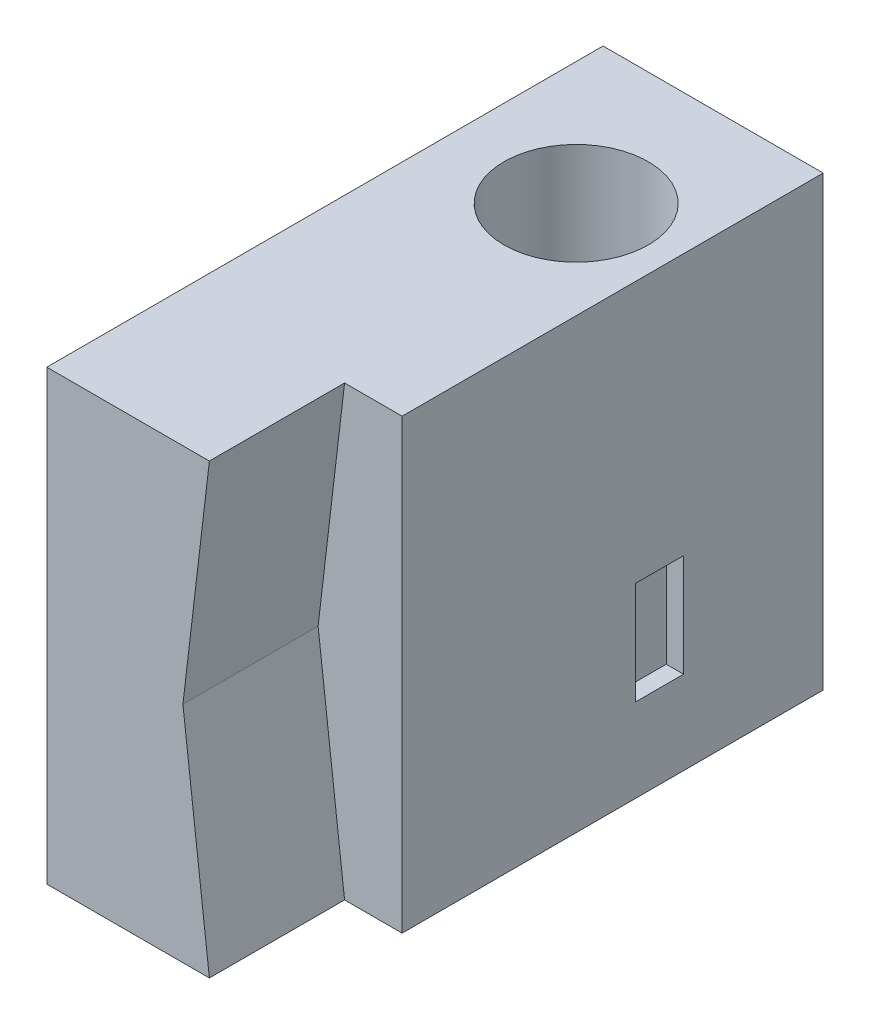
ISO-10303-21;
HEADER;
FILE_DESCRIPTION(('STEP AP214'),'2;1');
FILE_NAME('part.step','',(''),(''),'','','');
FILE_SCHEMA(('AUTOMOTIVE_DESIGN { 1 0 10303 214 1 1 1 1 }'));
ENDSEC;
DATA;
#1=APPLICATION_CONTEXT('core data for automotive mechanical design processes');
#2=APPLICATION_PROTOCOL_DEFINITION('international standard','automotive_design',2000,#1);
#3=PRODUCT_CONTEXT('',#1,'mechanical');
#4=PRODUCT('Part','Part','',(#3));
#5=PRODUCT_RELATED_PRODUCT_CATEGORY('part','',(#4));
#6=PRODUCT_DEFINITION_FORMATION('','',#4);
#7=PRODUCT_DEFINITION_CONTEXT('part definition',#1,'design');
#8=PRODUCT_DEFINITION('design','',#6,#7);
#9=PRODUCT_DEFINITION_SHAPE('','',#8);
#10=(LENGTH_UNIT() NAMED_UNIT(*) SI_UNIT(.MILLI.,.METRE.));
#11=(NAMED_UNIT(*) PLANE_ANGLE_UNIT() SI_UNIT($,.RADIAN.));
#12=(NAMED_UNIT(*) SI_UNIT($,.STERADIAN.) SOLID_ANGLE_UNIT());
#13=UNCERTAINTY_MEASURE_WITH_UNIT(LENGTH_MEASURE(1.E-05),#10,'distance_accuracy_value','');
#14=(GEOMETRIC_REPRESENTATION_CONTEXT(3) GLOBAL_UNCERTAINTY_ASSIGNED_CONTEXT((#13)) GLOBAL_UNIT_ASSIGNED_CONTEXT((#10,
#11,#12)) REPRESENTATION_CONTEXT('',''));
#15=CARTESIAN_POINT('',(0.,0.,0.));
#16=DIRECTION('',(0.,0.,1.));
#17=DIRECTION('',(1.,0.,0.));
#18=AXIS2_PLACEMENT_3D('',#15,#16,#17);
#19=CARTESIAN_POINT('',(0.,0.,0.));
#20=DIRECTION('',(1.,0.,0.));
#21=DIRECTION('',(0.,1.,0.));
#22=AXIS2_PLACEMENT_3D('',#19,#20,#21);
#23=PLANE('',#22);
#24=DIRECTION('',(0.,1.,0.));
#25=VECTOR('',#24,1.);
#26=CARTESIAN_POINT('',(0.,0.,70.272468367725));
#27=LINE('',#26,#25);
#28=CARTESIAN_POINT('',(0.,0.,70.272468367725));
#29=VERTEX_POINT('',#28);
#30=CARTESIAN_POINT('',(0.,56.558074341298,70.272468367725));
#31=VERTEX_POINT('',#30);
#32=EDGE_CURVE('E44',#29,#31,#27,.T.);
#33=ORIENTED_EDGE('',*,*,#32,.T.);
#34=DIRECTION('',(0.,0.,1.));
#35=VECTOR('',#34,1.);
#36=CARTESIAN_POINT('',(0.,56.558074341298,0.));
#37=LINE('',#36,#35);
#38=CARTESIAN_POINT('',(0.,56.558074341298,0.));
#39=VERTEX_POINT('',#38);
#40=EDGE_CURVE('E202',#39,#31,#37,.T.);
#41=ORIENTED_EDGE('',*,*,#40,.F.);
#42=DIRECTION('',(0.,1.,0.));
#43=VECTOR('',#42,1.);
#44=CARTESIAN_POINT('',(0.,0.,0.));
#45=LINE('',#44,#43);
#46=CARTESIAN_POINT('',(0.,0.,0.));
#47=VERTEX_POINT('',#46);
#48=EDGE_CURVE('E207',#47,#39,#45,.T.);
#49=ORIENTED_EDGE('',*,*,#48,.F.);
#50=DIRECTION('',(0.,0.,1.));
#51=VECTOR('',#50,1.);
#52=CARTESIAN_POINT('',(0.,0.,0.));
#53=LINE('',#52,#51);
#54=EDGE_CURVE('E10',#47,#29,#53,.T.);
#55=ORIENTED_EDGE('',*,*,#54,.T.);
#56=EDGE_LOOP('',(#33,#41,#49,#55));
#57=FACE_BOUND('',#56,.T.);
#58=ADVANCED_FACE('F16',(#57),#23,.F.);
#59=CARTESIAN_POINT('',(0.,0.,0.));
#60=DIRECTION('',(0.,1.,0.));
#61=DIRECTION('',(1.,0.,0.));
#62=AXIS2_PLACEMENT_3D('',#59,#60,#61);
#63=PLANE('',#62);
#64=CARTESIAN_POINT('',(15.510128446541,0.,18.912668158997));
#65=DIRECTION('',(0.,1.,0.));
#66=DIRECTION('',(0.,0.,1.));
#67=AXIS2_PLACEMENT_3D('',#64,#65,#66);
#68=CIRCLE('',#67,9.115869252358);
#69=CARTESIAN_POINT('',(15.510128446541,0.,28.028537411355));
#70=VERTEX_POINT('',#69);
#71=EDGE_CURVE('E198',#70,#70,#68,.T.);
#72=ORIENTED_EDGE('',*,*,#71,.T.);
#73=EDGE_LOOP('',(#72));
#74=FACE_BOUND('',#73,.T.);
#75=DIRECTION('',(1.,0.,0.));
#76=VECTOR('',#75,1.);
#77=CARTESIAN_POINT('',(20.536568841032,0.,53.193874005536));
#78=LINE('',#77,#76);
#79=CARTESIAN_POINT('',(20.536568841032,0.,53.193874005536));
#80=VERTEX_POINT('',#79);
#81=CARTESIAN_POINT('',(27.805146498668,0.,53.193874005536));
#82=VERTEX_POINT('',#81);
#83=EDGE_CURVE('E219',#80,#82,#78,.T.);
#84=ORIENTED_EDGE('',*,*,#83,.F.);
#85=DIRECTION('',(0.,0.,-1.));
#86=VECTOR('',#85,1.);
#87=CARTESIAN_POINT('',(20.536568841032,0.,70.272468367725));
#88=LINE('',#87,#86);
#89=CARTESIAN_POINT('',(20.536568841032,0.,70.272468367725));
#90=VERTEX_POINT('',#89);
#91=EDGE_CURVE('E211',#90,#80,#88,.T.);
#92=ORIENTED_EDGE('',*,*,#91,.F.);
#93=DIRECTION('',(1.,0.,0.));
#94=VECTOR('',#93,1.);
#95=CARTESIAN_POINT('',(0.,0.,70.272468367725));
#96=LINE('',#95,#94);
#97=EDGE_CURVE('E25',#29,#90,#96,.T.);
#98=ORIENTED_EDGE('',*,*,#97,.F.);
#99=ORIENTED_EDGE('',*,*,#54,.F.);
#100=DIRECTION('',(1.,0.,0.));
#101=VECTOR('',#100,1.);
#102=CARTESIAN_POINT('',(0.,0.,0.));
#103=LINE('',#102,#101);
#104=CARTESIAN_POINT('',(27.805146498668,0.,0.));
#105=VERTEX_POINT('',#104);
#106=EDGE_CURVE('E243',#47,#105,#103,.T.);
#107=ORIENTED_EDGE('',*,*,#106,.T.);
#108=DIRECTION('',(0.,0.,1.));
#109=VECTOR('',#108,1.);
#110=CARTESIAN_POINT('',(27.805146498668,0.,0.));
#111=LINE('',#110,#109);
#112=EDGE_CURVE('E230',#105,#82,#111,.T.);
#113=ORIENTED_EDGE('',*,*,#112,.T.);
#114=EDGE_LOOP('',(#84,#92,#98,#99,#107,#113));
#115=FACE_BOUND('',#114,.T.);
#116=ADVANCED_FACE('F18',(#74,#115),#63,.F.);
#117=CARTESIAN_POINT('',(0.,0.,70.272468367725));
#118=DIRECTION('',(0.,0.,1.));
#119=DIRECTION('',(1.,0.,0.));
#120=AXIS2_PLACEMENT_3D('',#117,#118,#119);
#121=PLANE('',#120);
#122=DIRECTION('',(1.,0.,0.));
#123=VECTOR('',#122,1.);
#124=CARTESIAN_POINT('',(0.,56.558074341298,70.272468367725));
#125=LINE('',#124,#123);
#126=CARTESIAN_POINT('',(20.536568841032,56.558074341298,70.272468367725));
#127=VERTEX_POINT('',#126);
#128=EDGE_CURVE('E206',#31,#127,#125,.T.);
#129=ORIENTED_EDGE('',*,*,#128,.F.);
#130=ORIENTED_EDGE('',*,*,#32,.F.);
#131=ORIENTED_EDGE('',*,*,#97,.T.);
#132=DIRECTION('',(0.117381692650987,-0.993086873455887,0.));
#133=VECTOR('',#132,1.);
#134=CARTESIAN_POINT('',(17.194020129172,28.279037170649,70.272468367725));
#135=LINE('',#134,#133);
#136=CARTESIAN_POINT('',(17.194020129172,28.279037170649,70.272468367725));
#137=VERTEX_POINT('',#136);
#138=EDGE_CURVE('E201',#137,#90,#135,.T.);
#139=ORIENTED_EDGE('',*,*,#138,.F.);
#140=DIRECTION('',(-0.117381692650987,-0.993086873455887,0.));
#141=VECTOR('',#140,1.);
#142=CARTESIAN_POINT('',(20.536568841032,56.558074341298,70.272468367725));
#143=LINE('',#142,#141);
#144=EDGE_CURVE('E174',#127,#137,#143,.T.);
#145=ORIENTED_EDGE('',*,*,#144,.F.);
#146=EDGE_LOOP('',(#129,#130,#131,#139,#145));
#147=FACE_BOUND('',#146,.T.);
#148=ADVANCED_FACE('F255',(#147),#121,.T.);
#149=CARTESIAN_POINT('',(0.,56.558074341298,0.));
#150=DIRECTION('',(0.,1.,0.));
#151=DIRECTION('',(1.,0.,0.));
#152=AXIS2_PLACEMENT_3D('',#149,#150,#151);
#153=PLANE('',#152);
#154=CARTESIAN_POINT('',(15.510128446541,56.558074341298,18.912668158997));
#155=DIRECTION('',(0.,1.,0.));
#156=DIRECTION('',(0.,0.,1.));
#157=AXIS2_PLACEMENT_3D('',#154,#155,#156);
#158=CIRCLE('',#157,9.115869252358);
#159=CARTESIAN_POINT('',(15.510128446541,56.558074341298,28.028537411355));
#160=VERTEX_POINT('',#159);
#161=EDGE_CURVE('E195',#160,#160,#158,.T.);
#162=ORIENTED_EDGE('',*,*,#161,.F.);
#163=EDGE_LOOP('',(#162));
#164=FACE_BOUND('',#163,.T.);
#165=DIRECTION('',(0.,0.,1.));
#166=VECTOR('',#165,1.);
#167=CARTESIAN_POINT('',(27.805146498668,56.558074341298,0.));
#168=LINE('',#167,#166);
#169=CARTESIAN_POINT('',(27.805146498668,56.558074341298,0.));
#170=VERTEX_POINT('',#169);
#171=CARTESIAN_POINT('',(27.805146498668,56.558074341298,53.193874005536));
#172=VERTEX_POINT('',#171);
#173=EDGE_CURVE('E234',#170,#172,#168,.T.);
#174=ORIENTED_EDGE('',*,*,#173,.F.);
#175=DIRECTION('',(1.,0.,0.));
#176=VECTOR('',#175,1.);
#177=CARTESIAN_POINT('',(0.,56.558074341298,0.));
#178=LINE('',#177,#176);
#179=EDGE_CURVE('E237',#39,#170,#178,.T.);
#180=ORIENTED_EDGE('',*,*,#179,.F.);
#181=ORIENTED_EDGE('',*,*,#40,.T.);
#182=ORIENTED_EDGE('',*,*,#128,.T.);
#183=DIRECTION('',(0.,0.,-1.));
#184=VECTOR('',#183,1.);
#185=CARTESIAN_POINT('',(20.536568841032,56.558074341298,70.272468367725));
#186=LINE('',#185,#184);
#187=CARTESIAN_POINT('',(20.536568841032,56.558074341298,53.193874005536));
#188=VERTEX_POINT('',#187);
#189=EDGE_CURVE('E184',#127,#188,#186,.T.);
#190=ORIENTED_EDGE('',*,*,#189,.T.);
#191=DIRECTION('',(-1.,0.,0.));
#192=VECTOR('',#191,1.);
#193=CARTESIAN_POINT('',(27.805146498668,56.558074341298,53.193874005536));
#194=LINE('',#193,#192);
#195=EDGE_CURVE('E227',#172,#188,#194,.T.);
#196=ORIENTED_EDGE('',*,*,#195,.F.);
#197=EDGE_LOOP('',(#174,#180,#181,#182,#190,#196));
#198=FACE_BOUND('',#197,.T.);
#199=ADVANCED_FACE('F457',(#164,#198),#153,.T.);
#200=CARTESIAN_POINT('',(0.,0.,0.));
#201=DIRECTION('',(0.,0.,1.));
#202=DIRECTION('',(1.,0.,0.));
#203=AXIS2_PLACEMENT_3D('',#200,#201,#202);
#204=PLANE('',#203);
#205=ORIENTED_EDGE('',*,*,#179,.T.);
#206=DIRECTION('',(0.,1.,0.));
#207=VECTOR('',#206,1.);
#208=CARTESIAN_POINT('',(27.805146498668,0.,0.));
#209=LINE('',#208,#207);
#210=EDGE_CURVE('E233',#105,#170,#209,.T.);
#211=ORIENTED_EDGE('',*,*,#210,.F.);
#212=ORIENTED_EDGE('',*,*,#106,.F.);
#213=ORIENTED_EDGE('',*,*,#48,.T.);
#214=EDGE_LOOP('',(#205,#211,#212,#213));
#215=FACE_BOUND('',#214,.T.);
#216=ADVANCED_FACE('F452',(#215),#204,.F.);
#217=CARTESIAN_POINT('',(27.805146498668,0.,0.));
#218=DIRECTION('',(1.,0.,0.));
#219=DIRECTION('',(0.,1.,0.));
#220=AXIS2_PLACEMENT_3D('',#217,#218,#219);
#221=PLANE('',#220);
#222=DIRECTION('',(0.,1.,0.));
#223=VECTOR('',#222,1.);
#224=CARTESIAN_POINT('',(27.805146498668,10.552380935276,17.639196290359));
#225=LINE('',#224,#223);
#226=CARTESIAN_POINT('',(27.805146498668,10.552380935276,17.639196290359));
#227=VERTEX_POINT('',#226);
#228=CARTESIAN_POINT('',(27.805146498668,23.52491854681,17.639196290359));
#229=VERTEX_POINT('',#228);
#230=EDGE_CURVE('E160',#227,#229,#225,.T.);
#231=ORIENTED_EDGE('',*,*,#230,.F.);
#232=DIRECTION('',(0.,0.,-1.));
#233=VECTOR('',#232,1.);
#234=CARTESIAN_POINT('',(27.805146498668,10.552380935276,23.686895368077));
#235=LINE('',#234,#233);
#236=CARTESIAN_POINT('',(27.805146498668,10.552380935276,23.686895368077));
#237=VERTEX_POINT('',#236);
#238=EDGE_CURVE('E151',#237,#227,#235,.T.);
#239=ORIENTED_EDGE('',*,*,#238,.F.);
#240=DIRECTION('',(0.,-1.,0.));
#241=VECTOR('',#240,1.);
#242=CARTESIAN_POINT('',(27.805146498668,23.52491854681,23.686895368077));
#243=LINE('',#242,#241);
#244=CARTESIAN_POINT('',(27.805146498668,23.52491854681,23.686895368077));
#245=VERTEX_POINT('',#244);
#246=EDGE_CURVE('E136',#245,#237,#243,.T.);
#247=ORIENTED_EDGE('',*,*,#246,.F.);
#248=DIRECTION('',(0.,0.,1.));
#249=VECTOR('',#248,1.);
#250=CARTESIAN_POINT('',(27.805146498668,23.52491854681,17.639196290359));
#251=LINE('',#250,#249);
#252=EDGE_CURVE('E178',#229,#245,#251,.T.);
#253=ORIENTED_EDGE('',*,*,#252,.F.);
#254=EDGE_LOOP('',(#231,#239,#247,#253));
#255=FACE_BOUND('',#254,.T.);
#256=ORIENTED_EDGE('',*,*,#112,.F.);
#257=ORIENTED_EDGE('',*,*,#210,.T.);
#258=ORIENTED_EDGE('',*,*,#173,.T.);
#259=DIRECTION('',(0.,1.,0.));
#260=VECTOR('',#259,1.);
#261=CARTESIAN_POINT('',(27.805146498668,0.,53.193874005536));
#262=LINE('',#261,#260);
#263=EDGE_CURVE('E223',#82,#172,#262,.T.);
#264=ORIENTED_EDGE('',*,*,#263,.F.);
#265=EDGE_LOOP('',(#256,#257,#258,#264));
#266=FACE_BOUND('',#265,.T.);
#267=ADVANCED_FACE('F158',(#255,#266),#221,.T.);
#268=CARTESIAN_POINT('',(23.416346245089,28.279037170649,53.193874005536));
#269=DIRECTION('',(0.,0.,1.));
#270=DIRECTION('',(1.,0.,0.));
#271=AXIS2_PLACEMENT_3D('',#268,#269,#270);
#272=PLANE('',#271);
#273=ORIENTED_EDGE('',*,*,#83,.T.);
#274=ORIENTED_EDGE('',*,*,#263,.T.);
#275=ORIENTED_EDGE('',*,*,#195,.T.);
#276=DIRECTION('',(-0.117381692650987,-0.993086873455887,0.));
#277=VECTOR('',#276,1.);
#278=CARTESIAN_POINT('',(20.536568841032,56.558074341298,53.193874005536));
#279=LINE('',#278,#277);
#280=CARTESIAN_POINT('',(17.194020129172,28.279037170649,53.193874005536));
#281=VERTEX_POINT('',#280);
#282=EDGE_CURVE('E180',#188,#281,#279,.T.);
#283=ORIENTED_EDGE('',*,*,#282,.T.);
#284=DIRECTION('',(0.117381692650987,-0.993086873455887,0.));
#285=VECTOR('',#284,1.);
#286=CARTESIAN_POINT('',(17.194020129172,28.279037170649,53.193874005536));
#287=LINE('',#286,#285);
#288=EDGE_CURVE('E215',#281,#80,#287,.T.);
#289=ORIENTED_EDGE('',*,*,#288,.T.);
#290=EDGE_LOOP('',(#273,#274,#275,#283,#289));
#291=FACE_BOUND('',#290,.T.);
#292=ADVANCED_FACE('F522',(#291),#272,.T.);
#293=CARTESIAN_POINT('',(17.194020129172,28.279037170649,70.272468367725));
#294=DIRECTION('',(-0.993086873455887,-0.117381692650987,0.));
#295=DIRECTION('',(-0.117381692650987,0.993086873455887,0.));
#296=AXIS2_PLACEMENT_3D('',#293,#294,#295);
#297=PLANE('',#296);
#298=ORIENTED_EDGE('',*,*,#138,.T.);
#299=ORIENTED_EDGE('',*,*,#91,.T.);
#300=ORIENTED_EDGE('',*,*,#288,.F.);
#301=DIRECTION('',(0.,0.,-1.));
#302=VECTOR('',#301,1.);
#303=CARTESIAN_POINT('',(17.194020129172,28.279037170649,70.272468367725));
#304=LINE('',#303,#302);
#305=EDGE_CURVE('E185',#137,#281,#304,.T.);
#306=ORIENTED_EDGE('',*,*,#305,.F.);
#307=EDGE_LOOP('',(#298,#299,#300,#306));
#308=FACE_BOUND('',#307,.T.);
#309=ADVANCED_FACE('F260',(#308),#297,.F.);
#310=CARTESIAN_POINT('',(15.510128446541,56.558074341298,18.912668158997));
#311=DIRECTION('',(0.,1.,0.));
#312=DIRECTION('',(0.,0.,1.));
#313=AXIS2_PLACEMENT_3D('',#310,#311,#312);
#314=CYLINDRICAL_SURFACE('',#313,9.115869252358);
#315=ORIENTED_EDGE('',*,*,#71,.F.);
#316=EDGE_LOOP('',(#315));
#317=FACE_BOUND('',#316,.T.);
#318=ORIENTED_EDGE('',*,*,#161,.T.);
#319=EDGE_LOOP('',(#318));
#320=FACE_BOUND('',#319,.T.);
#321=ADVANCED_FACE('F433',(#317,#320),#314,.F.);
#322=CARTESIAN_POINT('',(20.536568841032,56.558074341298,70.272468367725));
#323=DIRECTION('',(-0.993086873455887,0.117381692650987,0.));
#324=DIRECTION('',(0.,0.,1.));
#325=AXIS2_PLACEMENT_3D('',#322,#323,#324);
#326=PLANE('',#325);
#327=ORIENTED_EDGE('',*,*,#144,.T.);
#328=ORIENTED_EDGE('',*,*,#305,.T.);
#329=ORIENTED_EDGE('',*,*,#282,.F.);
#330=ORIENTED_EDGE('',*,*,#189,.F.);
#331=EDGE_LOOP('',(#327,#328,#329,#330));
#332=FACE_BOUND('',#331,.T.);
#333=ADVANCED_FACE('F268',(#332),#326,.F.);
#334=CARTESIAN_POINT('',(27.805146498668,10.552380935276,17.639196290359));
#335=DIRECTION('',(0.,0.,-1.));
#336=DIRECTION('',(0.,-1.,0.));
#337=AXIS2_PLACEMENT_3D('',#334,#335,#336);
#338=PLANE('',#337);
#339=ORIENTED_EDGE('',*,*,#230,.T.);
#340=DIRECTION('',(-1.,0.,0.));
#341=VECTOR('',#340,1.);
#342=CARTESIAN_POINT('',(27.805146498668,23.52491854681,17.639196290359));
#343=LINE('',#342,#341);
#344=CARTESIAN_POINT('',(25.619582915084,23.52491854681,17.639196290359));
#345=VERTEX_POINT('',#344);
#346=EDGE_CURVE('E176',#229,#345,#343,.T.);
#347=ORIENTED_EDGE('',*,*,#346,.T.);
#348=DIRECTION('',(0.,1.,0.));
#349=VECTOR('',#348,1.);
#350=CARTESIAN_POINT('',(25.619582915084,10.552380935276,17.639196290359));
#351=LINE('',#350,#349);
#352=CARTESIAN_POINT('',(25.619582915084,10.552380935276,17.639196290359));
#353=VERTEX_POINT('',#352);
#354=EDGE_CURVE('E738',#353,#345,#351,.T.);
#355=ORIENTED_EDGE('',*,*,#354,.F.);
#356=DIRECTION('',(-1.,0.,0.));
#357=VECTOR('',#356,1.);
#358=CARTESIAN_POINT('',(27.805146498668,10.552380935276,17.639196290359));
#359=LINE('',#358,#357);
#360=EDGE_CURVE('E156',#227,#353,#359,.T.);
#361=ORIENTED_EDGE('',*,*,#360,.F.);
#362=EDGE_LOOP('',(#339,#347,#355,#361));
#363=FACE_BOUND('',#362,.T.);
#364=ADVANCED_FACE('F432',(#363),#338,.F.);
#365=CARTESIAN_POINT('',(27.805146498668,23.52491854681,17.639196290359));
#366=DIRECTION('',(0.,1.,0.));
#367=DIRECTION('',(1.,0.,0.));
#368=AXIS2_PLACEMENT_3D('',#365,#366,#367);
#369=PLANE('',#368);
#370=ORIENTED_EDGE('',*,*,#252,.T.);
#371=DIRECTION('',(-1.,0.,0.));
#372=VECTOR('',#371,1.);
#373=CARTESIAN_POINT('',(27.805146498668,23.52491854681,23.686895368077));
#374=LINE('',#373,#372);
#375=CARTESIAN_POINT('',(25.619582915084,23.52491854681,23.686895368077));
#376=VERTEX_POINT('',#375);
#377=EDGE_CURVE('E142',#245,#376,#374,.T.);
#378=ORIENTED_EDGE('',*,*,#377,.T.);
#379=DIRECTION('',(0.,0.,1.));
#380=VECTOR('',#379,1.);
#381=CARTESIAN_POINT('',(25.619582915084,23.52491854681,17.639196290359));
#382=LINE('',#381,#380);
#383=EDGE_CURVE('E735',#345,#376,#382,.T.);
#384=ORIENTED_EDGE('',*,*,#383,.F.);
#385=ORIENTED_EDGE('',*,*,#346,.F.);
#386=EDGE_LOOP('',(#370,#378,#384,#385));
#387=FACE_BOUND('',#386,.T.);
#388=ADVANCED_FACE('F470',(#387),#369,.F.);
#389=CARTESIAN_POINT('',(27.805146498668,23.52491854681,23.686895368077));
#390=DIRECTION('',(0.,0.,1.));
#391=DIRECTION('',(1.,0.,0.));
#392=AXIS2_PLACEMENT_3D('',#389,#390,#391);
#393=PLANE('',#392);
#394=ORIENTED_EDGE('',*,*,#246,.T.);
#395=DIRECTION('',(-1.,0.,0.));
#396=VECTOR('',#395,1.);
#397=CARTESIAN_POINT('',(27.805146498668,10.552380935276,23.686895368077));
#398=LINE('',#397,#396);
#399=CARTESIAN_POINT('',(25.619582915084,10.552380935276,23.686895368077));
#400=VERTEX_POINT('',#399);
#401=EDGE_CURVE('E140',#237,#400,#398,.T.);
#402=ORIENTED_EDGE('',*,*,#401,.T.);
#403=DIRECTION('',(0.,-1.,0.));
#404=VECTOR('',#403,1.);
#405=CARTESIAN_POINT('',(25.619582915084,23.52491854681,23.686895368077));
#406=LINE('',#405,#404);
#407=EDGE_CURVE('E170',#376,#400,#406,.T.);
#408=ORIENTED_EDGE('',*,*,#407,.F.);
#409=ORIENTED_EDGE('',*,*,#377,.F.);
#410=EDGE_LOOP('',(#394,#402,#408,#409));
#411=FACE_BOUND('',#410,.T.);
#412=ADVANCED_FACE('F138',(#411),#393,.F.);
#413=CARTESIAN_POINT('',(27.805146498668,10.552380935276,23.686895368077));
#414=DIRECTION('',(0.,-1.,0.));
#415=DIRECTION('',(0.,0.,-1.));
#416=AXIS2_PLACEMENT_3D('',#413,#414,#415);
#417=PLANE('',#416);
#418=ORIENTED_EDGE('',*,*,#238,.T.);
#419=ORIENTED_EDGE('',*,*,#360,.T.);
#420=DIRECTION('',(0.,0.,-1.));
#421=VECTOR('',#420,1.);
#422=CARTESIAN_POINT('',(25.619582915084,10.552380935276,23.686895368077));
#423=LINE('',#422,#421);
#424=EDGE_CURVE('E153',#400,#353,#423,.T.);
#425=ORIENTED_EDGE('',*,*,#424,.F.);
#426=ORIENTED_EDGE('',*,*,#401,.F.);
#427=EDGE_LOOP('',(#418,#419,#425,#426));
#428=FACE_BOUND('',#427,.T.);
#429=ADVANCED_FACE('F150',(#428),#417,.F.);
#430=CARTESIAN_POINT('',(25.619582915084,17.038649741043,20.663045829218));
#431=DIRECTION('',(1.,0.,0.));
#432=DIRECTION('',(0.,0.,1.));
#433=AXIS2_PLACEMENT_3D('',#430,#431,#432);
#434=PLANE('',#433);
#435=ORIENTED_EDGE('',*,*,#354,.T.);
#436=ORIENTED_EDGE('',*,*,#383,.T.);
#437=ORIENTED_EDGE('',*,*,#407,.T.);
#438=ORIENTED_EDGE('',*,*,#424,.T.);
#439=EDGE_LOOP('',(#435,#436,#437,#438));
#440=FACE_BOUND('',#439,.T.);
#441=ADVANCED_FACE('F415',(#440),#434,.T.);
#442=CLOSED_SHELL('',(#58,#116,#148,#199,#216,#267,#292,#309,#321,#333,#364,#388,#412,#429,#441));
#443=MANIFOLD_SOLID_BREP('B1',#442);
#444=ADVANCED_BREP_SHAPE_REPRESENTATION('',(#18,#443),#14);
#445=SHAPE_DEFINITION_REPRESENTATION(#9,#444);
ENDSEC;
END-ISO-10303-21;
